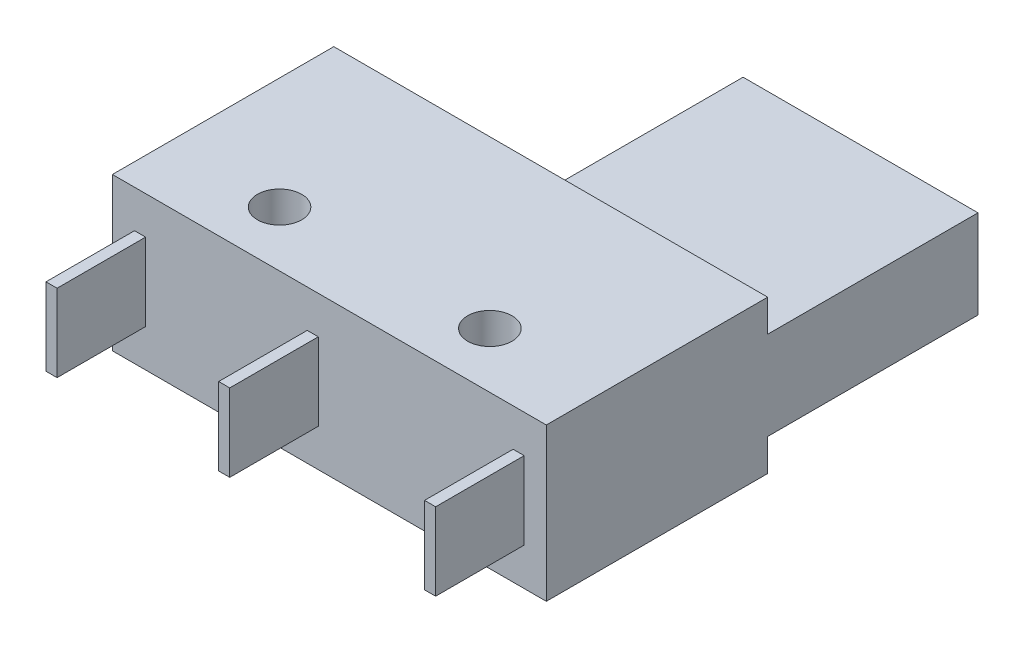
ISO-10303-21;
HEADER;
FILE_DESCRIPTION(('STEP AP214'),'2;1');
FILE_NAME('part.step','',(''),(''),'','','');
FILE_SCHEMA(('AUTOMOTIVE_DESIGN { 1 0 10303 214 1 1 1 1 }'));
ENDSEC;
DATA;
#1=APPLICATION_CONTEXT('core data for automotive mechanical design processes');
#2=APPLICATION_PROTOCOL_DEFINITION('international standard','automotive_design',2000,#1);
#3=PRODUCT_CONTEXT('',#1,'mechanical');
#4=PRODUCT('Part','Part','',(#3));
#5=PRODUCT_RELATED_PRODUCT_CATEGORY('part','',(#4));
#6=PRODUCT_DEFINITION_FORMATION('','',#4);
#7=PRODUCT_DEFINITION_CONTEXT('part definition',#1,'design');
#8=PRODUCT_DEFINITION('design','',#6,#7);
#9=PRODUCT_DEFINITION_SHAPE('','',#8);
#10=(LENGTH_UNIT() NAMED_UNIT(*) SI_UNIT(.MILLI.,.METRE.));
#11=(NAMED_UNIT(*) PLANE_ANGLE_UNIT() SI_UNIT($,.RADIAN.));
#12=(NAMED_UNIT(*) SI_UNIT($,.STERADIAN.) SOLID_ANGLE_UNIT());
#13=UNCERTAINTY_MEASURE_WITH_UNIT(LENGTH_MEASURE(1.E-05),#10,'distance_accuracy_value','');
#14=(GEOMETRIC_REPRESENTATION_CONTEXT(3) GLOBAL_UNCERTAINTY_ASSIGNED_CONTEXT((#13)) GLOBAL_UNIT_ASSIGNED_CONTEXT((#10,
#11,#12)) REPRESENTATION_CONTEXT('',''));
#15=CARTESIAN_POINT('',(0.,0.,0.));
#16=DIRECTION('',(0.,0.,1.));
#17=DIRECTION('',(1.,0.,0.));
#18=AXIS2_PLACEMENT_3D('',#15,#16,#17);
#19=CARTESIAN_POINT('',(0.,6.9,-10.));
#20=DIRECTION('',(0.,0.,1.));
#21=DIRECTION('',(1.,0.,0.));
#22=AXIS2_PLACEMENT_3D('',#19,#20,#21);
#23=PLANE('',#22);
#24=DIRECTION('',(1.,0.,0.));
#25=VECTOR('',#24,1.);
#26=CARTESIAN_POINT('',(19.6,5.45,-10.));
#27=LINE('',#26,#25);
#28=CARTESIAN_POINT('',(8.98876628778559,5.45,-10.));
#29=VERTEX_POINT('',#28);
#30=CARTESIAN_POINT('',(19.6,5.45,-10.));
#31=VERTEX_POINT('',#30);
#32=EDGE_CURVE('E52',#29,#31,#27,.T.);
#33=ORIENTED_EDGE('',*,*,#32,.F.);
#34=DIRECTION('',(0.,1.,0.));
#35=VECTOR('',#34,1.);
#36=CARTESIAN_POINT('',(8.98876628778559,5.45,-10.));
#37=LINE('',#36,#35);
#38=CARTESIAN_POINT('',(8.98876628778559,1.45,-10.));
#39=VERTEX_POINT('',#38);
#40=EDGE_CURVE('E211',#39,#29,#37,.T.);
#41=ORIENTED_EDGE('',*,*,#40,.F.);
#42=DIRECTION('',(-1.,0.,0.));
#43=VECTOR('',#42,1.);
#44=CARTESIAN_POINT('',(19.6,1.45,-10.));
#45=LINE('',#44,#43);
#46=CARTESIAN_POINT('',(19.6,1.45,-10.));
#47=VERTEX_POINT('',#46);
#48=EDGE_CURVE('E58',#47,#39,#45,.T.);
#49=ORIENTED_EDGE('',*,*,#48,.F.);
#50=DIRECTION('',(0.,-1.,0.));
#51=VECTOR('',#50,1.);
#52=CARTESIAN_POINT('',(19.6,6.9,-10.));
#53=LINE('',#52,#51);
#54=CARTESIAN_POINT('',(19.6,0.,-10.));
#55=VERTEX_POINT('',#54);
#56=EDGE_CURVE('E195',#47,#55,#53,.T.);
#57=ORIENTED_EDGE('',*,*,#56,.T.);
#58=DIRECTION('',(-1.,0.,0.));
#59=VECTOR('',#58,1.);
#60=CARTESIAN_POINT('',(0.,0.,-10.));
#61=LINE('',#60,#59);
#62=CARTESIAN_POINT('',(0.,0.,-10.));
#63=VERTEX_POINT('',#62);
#64=EDGE_CURVE('E320',#55,#63,#61,.T.);
#65=ORIENTED_EDGE('',*,*,#64,.T.);
#66=DIRECTION('',(0.,-1.,0.));
#67=VECTOR('',#66,1.);
#68=CARTESIAN_POINT('',(0.,6.9,-10.));
#69=LINE('',#68,#67);
#70=CARTESIAN_POINT('',(0.,6.9,-10.));
#71=VERTEX_POINT('',#70);
#72=EDGE_CURVE('E326',#71,#63,#69,.T.);
#73=ORIENTED_EDGE('',*,*,#72,.F.);
#74=DIRECTION('',(-1.,0.,0.));
#75=VECTOR('',#74,1.);
#76=CARTESIAN_POINT('',(0.,6.9,-10.));
#77=LINE('',#76,#75);
#78=CARTESIAN_POINT('',(19.6,6.9,-10.));
#79=VERTEX_POINT('',#78);
#80=EDGE_CURVE('E324',#79,#71,#77,.T.);
#81=ORIENTED_EDGE('',*,*,#80,.F.);
#82=EDGE_CURVE('E341',#79,#31,#53,.T.);
#83=ORIENTED_EDGE('',*,*,#82,.T.);
#84=EDGE_LOOP('',(#33,#41,#49,#57,#65,#73,#81,#83));
#85=FACE_BOUND('',#84,.T.);
#86=ADVANCED_FACE('F35',(#85),#23,.F.);
#87=CARTESIAN_POINT('',(0.,6.9,0.));
#88=DIRECTION('',(0.,0.,-1.));
#89=DIRECTION('',(-1.,0.,0.));
#90=AXIS2_PLACEMENT_3D('',#87,#88,#89);
#91=PLANE('',#90);
#92=DIRECTION('',(0.,-1.,0.));
#93=VECTOR('',#92,1.);
#94=CARTESIAN_POINT('',(8.8,5.2,0.));
#95=LINE('',#94,#93);
#96=CARTESIAN_POINT('',(8.8,5.2,0.));
#97=VERTEX_POINT('',#96);
#98=CARTESIAN_POINT('',(8.8,1.7,0.));
#99=VERTEX_POINT('',#98);
#100=EDGE_CURVE('E249',#97,#99,#95,.T.);
#101=ORIENTED_EDGE('',*,*,#100,.F.);
#102=DIRECTION('',(-1.,0.,0.));
#103=VECTOR('',#102,1.);
#104=CARTESIAN_POINT('',(8.8,5.2,0.));
#105=LINE('',#104,#103);
#106=CARTESIAN_POINT('',(9.3,5.2,0.));
#107=VERTEX_POINT('',#106);
#108=EDGE_CURVE('E254',#107,#97,#105,.T.);
#109=ORIENTED_EDGE('',*,*,#108,.F.);
#110=DIRECTION('',(0.,1.,0.));
#111=VECTOR('',#110,1.);
#112=CARTESIAN_POINT('',(9.3,5.2,0.));
#113=LINE('',#112,#111);
#114=CARTESIAN_POINT('',(9.3,1.7,0.));
#115=VERTEX_POINT('',#114);
#116=EDGE_CURVE('E266',#115,#107,#113,.T.);
#117=ORIENTED_EDGE('',*,*,#116,.F.);
#118=DIRECTION('',(1.,0.,0.));
#119=VECTOR('',#118,1.);
#120=CARTESIAN_POINT('',(8.8,1.7,0.));
#121=LINE('',#120,#119);
#122=EDGE_CURVE('E263',#99,#115,#121,.T.);
#123=ORIENTED_EDGE('',*,*,#122,.F.);
#124=EDGE_LOOP('',(#101,#109,#117,#123));
#125=FACE_BOUND('',#124,.T.);
#126=DIRECTION('',(1.,0.,0.));
#127=VECTOR('',#126,1.);
#128=CARTESIAN_POINT('',(0.,0.,0.));
#129=LINE('',#128,#127);
#130=CARTESIAN_POINT('',(0.,0.,0.));
#131=VERTEX_POINT('',#130);
#132=CARTESIAN_POINT('',(19.6,0.,0.));
#133=VERTEX_POINT('',#132);
#134=EDGE_CURVE('E329',#131,#133,#129,.T.);
#135=ORIENTED_EDGE('',*,*,#134,.T.);
#136=DIRECTION('',(0.,-1.,0.));
#137=VECTOR('',#136,1.);
#138=CARTESIAN_POINT('',(19.6,6.9,0.));
#139=LINE('',#138,#137);
#140=CARTESIAN_POINT('',(19.6,6.9,0.));
#141=VERTEX_POINT('',#140);
#142=EDGE_CURVE('E44',#141,#133,#139,.T.);
#143=ORIENTED_EDGE('',*,*,#142,.F.);
#144=DIRECTION('',(1.,0.,0.));
#145=VECTOR('',#144,1.);
#146=CARTESIAN_POINT('',(0.,6.9,0.));
#147=LINE('',#146,#145);
#148=CARTESIAN_POINT('',(0.,6.9,0.));
#149=VERTEX_POINT('',#148);
#150=EDGE_CURVE('E319',#149,#141,#147,.T.);
#151=ORIENTED_EDGE('',*,*,#150,.F.);
#152=DIRECTION('',(0.,-1.,0.));
#153=VECTOR('',#152,1.);
#154=CARTESIAN_POINT('',(0.,6.9,0.));
#155=LINE('',#154,#153);
#156=EDGE_CURVE('E11',#149,#131,#155,.T.);
#157=ORIENTED_EDGE('',*,*,#156,.T.);
#158=EDGE_LOOP('',(#135,#143,#151,#157));
#159=FACE_BOUND('',#158,.T.);
#160=DIRECTION('',(0.,-1.,0.));
#161=VECTOR('',#160,1.);
#162=CARTESIAN_POINT('',(1.,5.2,0.));
#163=LINE('',#162,#161);
#164=CARTESIAN_POINT('',(1.,5.2,0.));
#165=VERTEX_POINT('',#164);
#166=CARTESIAN_POINT('',(1.,1.7,0.));
#167=VERTEX_POINT('',#166);
#168=EDGE_CURVE('E282',#165,#167,#163,.T.);
#169=ORIENTED_EDGE('',*,*,#168,.F.);
#170=DIRECTION('',(-1.,0.,0.));
#171=VECTOR('',#170,1.);
#172=CARTESIAN_POINT('',(1.,5.2,0.));
#173=LINE('',#172,#171);
#174=CARTESIAN_POINT('',(1.5,5.2,0.));
#175=VERTEX_POINT('',#174);
#176=EDGE_CURVE('E287',#175,#165,#173,.T.);
#177=ORIENTED_EDGE('',*,*,#176,.F.);
#178=DIRECTION('',(0.,1.,0.));
#179=VECTOR('',#178,1.);
#180=CARTESIAN_POINT('',(1.5,5.2,0.));
#181=LINE('',#180,#179);
#182=CARTESIAN_POINT('',(1.5,1.7,0.));
#183=VERTEX_POINT('',#182);
#184=EDGE_CURVE('E299',#183,#175,#181,.T.);
#185=ORIENTED_EDGE('',*,*,#184,.F.);
#186=DIRECTION('',(1.,0.,0.));
#187=VECTOR('',#186,1.);
#188=CARTESIAN_POINT('',(1.,1.7,0.));
#189=LINE('',#188,#187);
#190=EDGE_CURVE('E296',#167,#183,#189,.T.);
#191=ORIENTED_EDGE('',*,*,#190,.F.);
#192=EDGE_LOOP('',(#169,#177,#185,#191));
#193=FACE_BOUND('',#192,.T.);
#194=DIRECTION('',(0.,-1.,0.));
#195=VECTOR('',#194,1.);
#196=CARTESIAN_POINT('',(18.1,5.2,0.));
#197=LINE('',#196,#195);
#198=CARTESIAN_POINT('',(18.1,5.2,0.));
#199=VERTEX_POINT('',#198);
#200=CARTESIAN_POINT('',(18.1,1.7,0.));
#201=VERTEX_POINT('',#200);
#202=EDGE_CURVE('E196',#199,#201,#197,.T.);
#203=ORIENTED_EDGE('',*,*,#202,.F.);
#204=DIRECTION('',(-1.,0.,0.));
#205=VECTOR('',#204,1.);
#206=CARTESIAN_POINT('',(18.1,5.2,0.));
#207=LINE('',#206,#205);
#208=CARTESIAN_POINT('',(18.6,5.2,0.));
#209=VERTEX_POINT('',#208);
#210=EDGE_CURVE('E224',#209,#199,#207,.T.);
#211=ORIENTED_EDGE('',*,*,#210,.F.);
#212=DIRECTION('',(0.,1.,0.));
#213=VECTOR('',#212,1.);
#214=CARTESIAN_POINT('',(18.6,5.2,0.));
#215=LINE('',#214,#213);
#216=CARTESIAN_POINT('',(18.6,1.7,0.));
#217=VERTEX_POINT('',#216);
#218=EDGE_CURVE('E233',#217,#209,#215,.T.);
#219=ORIENTED_EDGE('',*,*,#218,.F.);
#220=DIRECTION('',(1.,0.,0.));
#221=VECTOR('',#220,1.);
#222=CARTESIAN_POINT('',(18.1,1.7,0.));
#223=LINE('',#222,#221);
#224=EDGE_CURVE('E199',#201,#217,#223,.T.);
#225=ORIENTED_EDGE('',*,*,#224,.F.);
#226=EDGE_LOOP('',(#203,#211,#219,#225));
#227=FACE_BOUND('',#226,.T.);
#228=ADVANCED_FACE('F396',(#125,#159,#193,#227),#91,.F.);
#229=CARTESIAN_POINT('',(0.,6.9,0.));
#230=DIRECTION('',(1.,0.,0.));
#231=DIRECTION('',(0.,0.,-1.));
#232=AXIS2_PLACEMENT_3D('',#229,#230,#231);
#233=PLANE('',#232);
#234=DIRECTION('',(0.,0.,1.));
#235=VECTOR('',#234,1.);
#236=CARTESIAN_POINT('',(0.,0.,0.));
#237=LINE('',#236,#235);
#238=EDGE_CURVE('E315',#63,#131,#237,.T.);
#239=ORIENTED_EDGE('',*,*,#238,.T.);
#240=ORIENTED_EDGE('',*,*,#156,.F.);
#241=DIRECTION('',(0.,0.,1.));
#242=VECTOR('',#241,1.);
#243=CARTESIAN_POINT('',(0.,6.9,0.));
#244=LINE('',#243,#242);
#245=EDGE_CURVE('E316',#71,#149,#244,.T.);
#246=ORIENTED_EDGE('',*,*,#245,.F.);
#247=ORIENTED_EDGE('',*,*,#72,.T.);
#248=EDGE_LOOP('',(#239,#240,#246,#247));
#249=FACE_BOUND('',#248,.T.);
#250=ADVANCED_FACE('F37',(#249),#233,.F.);
#251=CARTESIAN_POINT('',(19.6,6.9,0.));
#252=DIRECTION('',(-1.,0.,0.));
#253=DIRECTION('',(0.,0.,1.));
#254=AXIS2_PLACEMENT_3D('',#251,#252,#253);
#255=PLANE('',#254);
#256=DIRECTION('',(0.,0.,-1.));
#257=VECTOR('',#256,1.);
#258=CARTESIAN_POINT('',(19.6,0.,0.));
#259=LINE('',#258,#257);
#260=EDGE_CURVE('E331',#133,#55,#259,.T.);
#261=ORIENTED_EDGE('',*,*,#260,.T.);
#262=ORIENTED_EDGE('',*,*,#56,.F.);
#263=DIRECTION('',(0.,0.,1.));
#264=VECTOR('',#263,1.);
#265=CARTESIAN_POINT('',(19.6,1.45,-19.5));
#266=LINE('',#265,#264);
#267=CARTESIAN_POINT('',(19.6,1.45,-19.5));
#268=VERTEX_POINT('',#267);
#269=EDGE_CURVE('E177',#268,#47,#266,.T.);
#270=ORIENTED_EDGE('',*,*,#269,.F.);
#271=DIRECTION('',(0.,-1.,0.));
#272=VECTOR('',#271,1.);
#273=CARTESIAN_POINT('',(19.6,5.45,-19.5));
#274=LINE('',#273,#272);
#275=CARTESIAN_POINT('',(19.6,5.45,-19.5));
#276=VERTEX_POINT('',#275);
#277=EDGE_CURVE('E183',#276,#268,#274,.T.);
#278=ORIENTED_EDGE('',*,*,#277,.F.);
#279=DIRECTION('',(0.,0.,1.));
#280=VECTOR('',#279,1.);
#281=CARTESIAN_POINT('',(19.6,5.45,-19.5));
#282=LINE('',#281,#280);
#283=EDGE_CURVE('E212',#276,#31,#282,.T.);
#284=ORIENTED_EDGE('',*,*,#283,.T.);
#285=ORIENTED_EDGE('',*,*,#82,.F.);
#286=DIRECTION('',(0.,0.,-1.));
#287=VECTOR('',#286,1.);
#288=CARTESIAN_POINT('',(19.6,6.9,0.));
#289=LINE('',#288,#287);
#290=EDGE_CURVE('E322',#141,#79,#289,.T.);
#291=ORIENTED_EDGE('',*,*,#290,.F.);
#292=ORIENTED_EDGE('',*,*,#142,.T.);
#293=EDGE_LOOP('',(#261,#262,#270,#278,#284,#285,#291,#292));
#294=FACE_BOUND('',#293,.T.);
#295=ADVANCED_FACE('F194',(#294),#255,.F.);
#296=CARTESIAN_POINT('',(0.,6.9,0.));
#297=DIRECTION('',(0.,-1.,0.));
#298=DIRECTION('',(0.,0.,-1.));
#299=AXIS2_PLACEMENT_3D('',#296,#297,#298);
#300=PLANE('',#299);
#301=CARTESIAN_POINT('',(14.55,6.9,-2.5));
#302=DIRECTION('',(0.,1.,0.));
#303=DIRECTION('',(0.,0.,1.));
#304=AXIS2_PLACEMENT_3D('',#301,#302,#303);
#305=CIRCLE('',#304,1.);
#306=CARTESIAN_POINT('',(14.55,6.9,-1.5));
#307=VERTEX_POINT('',#306);
#308=EDGE_CURVE('E365',#307,#307,#305,.T.);
#309=ORIENTED_EDGE('',*,*,#308,.F.);
#310=EDGE_LOOP('',(#309));
#311=FACE_BOUND('',#310,.T.);
#312=CARTESIAN_POINT('',(5.05,6.9,-2.5));
#313=DIRECTION('',(0.,1.,0.));
#314=DIRECTION('',(0.,0.,1.));
#315=AXIS2_PLACEMENT_3D('',#312,#313,#314);
#316=CIRCLE('',#315,1.);
#317=CARTESIAN_POINT('',(5.05,6.9,-1.5));
#318=VERTEX_POINT('',#317);
#319=EDGE_CURVE('E361',#318,#318,#316,.T.);
#320=ORIENTED_EDGE('',*,*,#319,.F.);
#321=EDGE_LOOP('',(#320));
#322=FACE_BOUND('',#321,.T.);
#323=ORIENTED_EDGE('',*,*,#245,.T.);
#324=ORIENTED_EDGE('',*,*,#150,.T.);
#325=ORIENTED_EDGE('',*,*,#290,.T.);
#326=ORIENTED_EDGE('',*,*,#80,.T.);
#327=EDGE_LOOP('',(#323,#324,#325,#326));
#328=FACE_BOUND('',#327,.T.);
#329=ADVANCED_FACE('F357',(#311,#322,#328),#300,.F.);
#330=CARTESIAN_POINT('',(0.,0.,0.));
#331=DIRECTION('',(0.,-1.,0.));
#332=DIRECTION('',(0.,0.,-1.));
#333=AXIS2_PLACEMENT_3D('',#330,#331,#332);
#334=PLANE('',#333);
#335=CARTESIAN_POINT('',(14.55,0.,-2.5));
#336=DIRECTION('',(0.,-1.,0.));
#337=DIRECTION('',(0.,0.,-1.));
#338=AXIS2_PLACEMENT_3D('',#335,#336,#337);
#339=CIRCLE('',#338,1.);
#340=CARTESIAN_POINT('',(14.55,0.,-3.5));
#341=VERTEX_POINT('',#340);
#342=EDGE_CURVE('E39',#341,#341,#339,.T.);
#343=ORIENTED_EDGE('',*,*,#342,.F.);
#344=EDGE_LOOP('',(#343));
#345=FACE_BOUND('',#344,.T.);
#346=CARTESIAN_POINT('',(5.05,0.,-2.5));
#347=DIRECTION('',(0.,-1.,0.));
#348=DIRECTION('',(0.,0.,-1.));
#349=AXIS2_PLACEMENT_3D('',#346,#347,#348);
#350=CIRCLE('',#349,1.);
#351=CARTESIAN_POINT('',(5.05,0.,-3.5));
#352=VERTEX_POINT('',#351);
#353=EDGE_CURVE('E364',#352,#352,#350,.T.);
#354=ORIENTED_EDGE('',*,*,#353,.F.);
#355=EDGE_LOOP('',(#354));
#356=FACE_BOUND('',#355,.T.);
#357=ORIENTED_EDGE('',*,*,#238,.F.);
#358=ORIENTED_EDGE('',*,*,#64,.F.);
#359=ORIENTED_EDGE('',*,*,#260,.F.);
#360=ORIENTED_EDGE('',*,*,#134,.F.);
#361=EDGE_LOOP('',(#357,#358,#359,#360));
#362=FACE_BOUND('',#361,.T.);
#363=ADVANCED_FACE('F352',(#345,#356,#362),#334,.T.);
#364=CARTESIAN_POINT('',(1.,5.2,4.));
#365=DIRECTION('',(1.,0.,0.));
#366=DIRECTION('',(0.,0.,-1.));
#367=AXIS2_PLACEMENT_3D('',#364,#365,#366);
#368=PLANE('',#367);
#369=ORIENTED_EDGE('',*,*,#168,.T.);
#370=DIRECTION('',(0.,0.,-1.));
#371=VECTOR('',#370,1.);
#372=CARTESIAN_POINT('',(1.,1.7,4.));
#373=LINE('',#372,#371);
#374=CARTESIAN_POINT('',(1.,1.7,4.));
#375=VERTEX_POINT('',#374);
#376=EDGE_CURVE('E312',#375,#167,#373,.T.);
#377=ORIENTED_EDGE('',*,*,#376,.F.);
#378=DIRECTION('',(0.,-1.,0.));
#379=VECTOR('',#378,1.);
#380=CARTESIAN_POINT('',(1.,5.2,4.));
#381=LINE('',#380,#379);
#382=CARTESIAN_POINT('',(1.,5.2,4.));
#383=VERTEX_POINT('',#382);
#384=EDGE_CURVE('E283',#383,#375,#381,.T.);
#385=ORIENTED_EDGE('',*,*,#384,.F.);
#386=DIRECTION('',(0.,0.,-1.));
#387=VECTOR('',#386,1.);
#388=CARTESIAN_POINT('',(1.,5.2,4.));
#389=LINE('',#388,#387);
#390=EDGE_CURVE('E293',#383,#165,#389,.T.);
#391=ORIENTED_EDGE('',*,*,#390,.T.);
#392=EDGE_LOOP('',(#369,#377,#385,#391));
#393=FACE_BOUND('',#392,.T.);
#394=ADVANCED_FACE('F376',(#393),#368,.F.);
#395=CARTESIAN_POINT('',(1.,1.7,4.));
#396=DIRECTION('',(0.,1.,0.));
#397=DIRECTION('',(-1.,0.,0.));
#398=AXIS2_PLACEMENT_3D('',#395,#396,#397);
#399=PLANE('',#398);
#400=ORIENTED_EDGE('',*,*,#190,.T.);
#401=DIRECTION('',(0.,0.,-1.));
#402=VECTOR('',#401,1.);
#403=CARTESIAN_POINT('',(1.5,1.7,4.));
#404=LINE('',#403,#402);
#405=CARTESIAN_POINT('',(1.5,1.7,4.));
#406=VERTEX_POINT('',#405);
#407=EDGE_CURVE('E309',#406,#183,#404,.T.);
#408=ORIENTED_EDGE('',*,*,#407,.F.);
#409=DIRECTION('',(1.,0.,0.));
#410=VECTOR('',#409,1.);
#411=CARTESIAN_POINT('',(1.,1.7,4.));
#412=LINE('',#411,#410);
#413=EDGE_CURVE('E286',#375,#406,#412,.T.);
#414=ORIENTED_EDGE('',*,*,#413,.F.);
#415=ORIENTED_EDGE('',*,*,#376,.T.);
#416=EDGE_LOOP('',(#400,#408,#414,#415));
#417=FACE_BOUND('',#416,.T.);
#418=ADVANCED_FACE('F426',(#417),#399,.F.);
#419=CARTESIAN_POINT('',(1.5,5.2,4.));
#420=DIRECTION('',(-1.,0.,0.));
#421=DIRECTION('',(0.,0.,1.));
#422=AXIS2_PLACEMENT_3D('',#419,#420,#421);
#423=PLANE('',#422);
#424=ORIENTED_EDGE('',*,*,#184,.T.);
#425=DIRECTION('',(0.,0.,-1.));
#426=VECTOR('',#425,1.);
#427=CARTESIAN_POINT('',(1.5,5.2,4.));
#428=LINE('',#427,#426);
#429=CARTESIAN_POINT('',(1.5,5.2,4.));
#430=VERTEX_POINT('',#429);
#431=EDGE_CURVE('E306',#430,#175,#428,.T.);
#432=ORIENTED_EDGE('',*,*,#431,.F.);
#433=DIRECTION('',(0.,1.,0.));
#434=VECTOR('',#433,1.);
#435=CARTESIAN_POINT('',(1.5,5.2,4.));
#436=LINE('',#435,#434);
#437=EDGE_CURVE('E289',#406,#430,#436,.T.);
#438=ORIENTED_EDGE('',*,*,#437,.F.);
#439=ORIENTED_EDGE('',*,*,#407,.T.);
#440=EDGE_LOOP('',(#424,#432,#438,#439));
#441=FACE_BOUND('',#440,.T.);
#442=ADVANCED_FACE('F436',(#441),#423,.F.);
#443=CARTESIAN_POINT('',(1.,5.2,4.));
#444=DIRECTION('',(0.,-1.,0.));
#445=DIRECTION('',(0.,0.,-1.));
#446=AXIS2_PLACEMENT_3D('',#443,#444,#445);
#447=PLANE('',#446);
#448=ORIENTED_EDGE('',*,*,#176,.T.);
#449=ORIENTED_EDGE('',*,*,#390,.F.);
#450=DIRECTION('',(-1.,0.,0.));
#451=VECTOR('',#450,1.);
#452=CARTESIAN_POINT('',(1.,5.2,4.));
#453=LINE('',#452,#451);
#454=EDGE_CURVE('E291',#430,#383,#453,.T.);
#455=ORIENTED_EDGE('',*,*,#454,.F.);
#456=ORIENTED_EDGE('',*,*,#431,.T.);
#457=EDGE_LOOP('',(#448,#449,#455,#456));
#458=FACE_BOUND('',#457,.T.);
#459=ADVANCED_FACE('F446',(#458),#447,.F.);
#460=CARTESIAN_POINT('',(0.,0.,4.));
#461=DIRECTION('',(0.,0.,1.));
#462=DIRECTION('',(1.,0.,0.));
#463=AXIS2_PLACEMENT_3D('',#460,#461,#462);
#464=PLANE('',#463);
#465=ORIENTED_EDGE('',*,*,#384,.T.);
#466=ORIENTED_EDGE('',*,*,#413,.T.);
#467=ORIENTED_EDGE('',*,*,#437,.T.);
#468=ORIENTED_EDGE('',*,*,#454,.T.);
#469=EDGE_LOOP('',(#465,#466,#467,#468));
#470=FACE_BOUND('',#469,.T.);
#471=ADVANCED_FACE('F456',(#470),#464,.T.);
#472=CARTESIAN_POINT('',(8.8,5.2,4.));
#473=DIRECTION('',(1.,0.,0.));
#474=DIRECTION('',(0.,0.,-1.));
#475=AXIS2_PLACEMENT_3D('',#472,#473,#474);
#476=PLANE('',#475);
#477=ORIENTED_EDGE('',*,*,#100,.T.);
#478=DIRECTION('',(0.,0.,-1.));
#479=VECTOR('',#478,1.);
#480=CARTESIAN_POINT('',(8.8,1.7,4.));
#481=LINE('',#480,#479);
#482=CARTESIAN_POINT('',(8.8,1.7,4.));
#483=VERTEX_POINT('',#482);
#484=EDGE_CURVE('E279',#483,#99,#481,.T.);
#485=ORIENTED_EDGE('',*,*,#484,.F.);
#486=DIRECTION('',(0.,-1.,0.));
#487=VECTOR('',#486,1.);
#488=CARTESIAN_POINT('',(8.8,5.2,4.));
#489=LINE('',#488,#487);
#490=CARTESIAN_POINT('',(8.8,5.2,4.));
#491=VERTEX_POINT('',#490);
#492=EDGE_CURVE('E250',#491,#483,#489,.T.);
#493=ORIENTED_EDGE('',*,*,#492,.F.);
#494=DIRECTION('',(0.,0.,-1.));
#495=VECTOR('',#494,1.);
#496=CARTESIAN_POINT('',(8.8,5.2,4.));
#497=LINE('',#496,#495);
#498=EDGE_CURVE('E260',#491,#97,#497,.T.);
#499=ORIENTED_EDGE('',*,*,#498,.T.);
#500=EDGE_LOOP('',(#477,#485,#493,#499));
#501=FACE_BOUND('',#500,.T.);
#502=ADVANCED_FACE('F466',(#501),#476,.F.);
#503=CARTESIAN_POINT('',(8.8,1.7,4.));
#504=DIRECTION('',(0.,1.,0.));
#505=DIRECTION('',(0.,0.,1.));
#506=AXIS2_PLACEMENT_3D('',#503,#504,#505);
#507=PLANE('',#506);
#508=ORIENTED_EDGE('',*,*,#122,.T.);
#509=DIRECTION('',(0.,0.,-1.));
#510=VECTOR('',#509,1.);
#511=CARTESIAN_POINT('',(9.3,1.7,4.));
#512=LINE('',#511,#510);
#513=CARTESIAN_POINT('',(9.3,1.7,4.));
#514=VERTEX_POINT('',#513);
#515=EDGE_CURVE('E276',#514,#115,#512,.T.);
#516=ORIENTED_EDGE('',*,*,#515,.F.);
#517=DIRECTION('',(1.,0.,0.));
#518=VECTOR('',#517,1.);
#519=CARTESIAN_POINT('',(8.8,1.7,4.));
#520=LINE('',#519,#518);
#521=EDGE_CURVE('E253',#483,#514,#520,.T.);
#522=ORIENTED_EDGE('',*,*,#521,.F.);
#523=ORIENTED_EDGE('',*,*,#484,.T.);
#524=EDGE_LOOP('',(#508,#516,#522,#523));
#525=FACE_BOUND('',#524,.T.);
#526=ADVANCED_FACE('F476',(#525),#507,.F.);
#527=CARTESIAN_POINT('',(9.3,5.2,4.));
#528=DIRECTION('',(-1.,0.,0.));
#529=DIRECTION('',(0.,0.,1.));
#530=AXIS2_PLACEMENT_3D('',#527,#528,#529);
#531=PLANE('',#530);
#532=ORIENTED_EDGE('',*,*,#116,.T.);
#533=DIRECTION('',(0.,0.,-1.));
#534=VECTOR('',#533,1.);
#535=CARTESIAN_POINT('',(9.3,5.2,4.));
#536=LINE('',#535,#534);
#537=CARTESIAN_POINT('',(9.3,5.2,4.));
#538=VERTEX_POINT('',#537);
#539=EDGE_CURVE('E273',#538,#107,#536,.T.);
#540=ORIENTED_EDGE('',*,*,#539,.F.);
#541=DIRECTION('',(0.,1.,0.));
#542=VECTOR('',#541,1.);
#543=CARTESIAN_POINT('',(9.3,5.2,4.));
#544=LINE('',#543,#542);
#545=EDGE_CURVE('E256',#514,#538,#544,.T.);
#546=ORIENTED_EDGE('',*,*,#545,.F.);
#547=ORIENTED_EDGE('',*,*,#515,.T.);
#548=EDGE_LOOP('',(#532,#540,#546,#547));
#549=FACE_BOUND('',#548,.T.);
#550=ADVANCED_FACE('F486',(#549),#531,.F.);
#551=CARTESIAN_POINT('',(8.8,5.2,4.));
#552=DIRECTION('',(0.,-1.,0.));
#553=DIRECTION('',(0.,0.,-1.));
#554=AXIS2_PLACEMENT_3D('',#551,#552,#553);
#555=PLANE('',#554);
#556=ORIENTED_EDGE('',*,*,#108,.T.);
#557=ORIENTED_EDGE('',*,*,#498,.F.);
#558=DIRECTION('',(-1.,0.,0.));
#559=VECTOR('',#558,1.);
#560=CARTESIAN_POINT('',(8.8,5.2,4.));
#561=LINE('',#560,#559);
#562=EDGE_CURVE('E258',#538,#491,#561,.T.);
#563=ORIENTED_EDGE('',*,*,#562,.F.);
#564=ORIENTED_EDGE('',*,*,#539,.T.);
#565=EDGE_LOOP('',(#556,#557,#563,#564));
#566=FACE_BOUND('',#565,.T.);
#567=ADVANCED_FACE('F496',(#566),#555,.F.);
#568=CARTESIAN_POINT('',(0.,0.,4.));
#569=DIRECTION('',(0.,0.,1.));
#570=DIRECTION('',(1.,0.,0.));
#571=AXIS2_PLACEMENT_3D('',#568,#569,#570);
#572=PLANE('',#571);
#573=ORIENTED_EDGE('',*,*,#492,.T.);
#574=ORIENTED_EDGE('',*,*,#521,.T.);
#575=ORIENTED_EDGE('',*,*,#545,.T.);
#576=ORIENTED_EDGE('',*,*,#562,.T.);
#577=EDGE_LOOP('',(#573,#574,#575,#576));
#578=FACE_BOUND('',#577,.T.);
#579=ADVANCED_FACE('F506',(#578),#572,.T.);
#580=CARTESIAN_POINT('',(18.1,5.2,4.));
#581=DIRECTION('',(1.,0.,0.));
#582=DIRECTION('',(0.,0.,-1.));
#583=AXIS2_PLACEMENT_3D('',#580,#581,#582);
#584=PLANE('',#583);
#585=ORIENTED_EDGE('',*,*,#202,.T.);
#586=DIRECTION('',(0.,0.,-1.));
#587=VECTOR('',#586,1.);
#588=CARTESIAN_POINT('',(18.1,1.7,4.));
#589=LINE('',#588,#587);
#590=CARTESIAN_POINT('',(18.1,1.7,4.));
#591=VERTEX_POINT('',#590);
#592=EDGE_CURVE('E246',#591,#201,#589,.T.);
#593=ORIENTED_EDGE('',*,*,#592,.F.);
#594=DIRECTION('',(0.,-1.,0.));
#595=VECTOR('',#594,1.);
#596=CARTESIAN_POINT('',(18.1,5.2,4.));
#597=LINE('',#596,#595);
#598=CARTESIAN_POINT('',(18.1,5.2,4.));
#599=VERTEX_POINT('',#598);
#600=EDGE_CURVE('E220',#599,#591,#597,.T.);
#601=ORIENTED_EDGE('',*,*,#600,.F.);
#602=DIRECTION('',(0.,0.,-1.));
#603=VECTOR('',#602,1.);
#604=CARTESIAN_POINT('',(18.1,5.2,4.));
#605=LINE('',#604,#603);
#606=EDGE_CURVE('E229',#599,#199,#605,.T.);
#607=ORIENTED_EDGE('',*,*,#606,.T.);
#608=EDGE_LOOP('',(#585,#593,#601,#607));
#609=FACE_BOUND('',#608,.T.);
#610=ADVANCED_FACE('F516',(#609),#584,.F.);
#611=CARTESIAN_POINT('',(18.1,1.7,4.));
#612=DIRECTION('',(0.,1.,0.));
#613=DIRECTION('',(-1.,0.,0.));
#614=AXIS2_PLACEMENT_3D('',#611,#612,#613);
#615=PLANE('',#614);
#616=ORIENTED_EDGE('',*,*,#224,.T.);
#617=DIRECTION('',(0.,0.,-1.));
#618=VECTOR('',#617,1.);
#619=CARTESIAN_POINT('',(18.6,1.7,4.));
#620=LINE('',#619,#618);
#621=CARTESIAN_POINT('',(18.6,1.7,4.));
#622=VERTEX_POINT('',#621);
#623=EDGE_CURVE('E243',#622,#217,#620,.T.);
#624=ORIENTED_EDGE('',*,*,#623,.F.);
#625=DIRECTION('',(1.,0.,0.));
#626=VECTOR('',#625,1.);
#627=CARTESIAN_POINT('',(18.1,1.7,4.));
#628=LINE('',#627,#626);
#629=EDGE_CURVE('E223',#591,#622,#628,.T.);
#630=ORIENTED_EDGE('',*,*,#629,.F.);
#631=ORIENTED_EDGE('',*,*,#592,.T.);
#632=EDGE_LOOP('',(#616,#624,#630,#631));
#633=FACE_BOUND('',#632,.T.);
#634=ADVANCED_FACE('F526',(#633),#615,.F.);
#635=CARTESIAN_POINT('',(18.6,5.2,4.));
#636=DIRECTION('',(-1.,0.,0.));
#637=DIRECTION('',(0.,-1.,0.));
#638=AXIS2_PLACEMENT_3D('',#635,#636,#637);
#639=PLANE('',#638);
#640=ORIENTED_EDGE('',*,*,#218,.T.);
#641=DIRECTION('',(0.,0.,-1.));
#642=VECTOR('',#641,1.);
#643=CARTESIAN_POINT('',(18.6,5.2,4.));
#644=LINE('',#643,#642);
#645=CARTESIAN_POINT('',(18.6,5.2,4.));
#646=VERTEX_POINT('',#645);
#647=EDGE_CURVE('E240',#646,#209,#644,.T.);
#648=ORIENTED_EDGE('',*,*,#647,.F.);
#649=DIRECTION('',(0.,1.,0.));
#650=VECTOR('',#649,1.);
#651=CARTESIAN_POINT('',(18.6,5.2,4.));
#652=LINE('',#651,#650);
#653=EDGE_CURVE('E226',#622,#646,#652,.T.);
#654=ORIENTED_EDGE('',*,*,#653,.F.);
#655=ORIENTED_EDGE('',*,*,#623,.T.);
#656=EDGE_LOOP('',(#640,#648,#654,#655));
#657=FACE_BOUND('',#656,.T.);
#658=ADVANCED_FACE('F536',(#657),#639,.F.);
#659=CARTESIAN_POINT('',(18.1,5.2,4.));
#660=DIRECTION('',(0.,-1.,0.));
#661=DIRECTION('',(0.,0.,-1.));
#662=AXIS2_PLACEMENT_3D('',#659,#660,#661);
#663=PLANE('',#662);
#664=ORIENTED_EDGE('',*,*,#210,.T.);
#665=ORIENTED_EDGE('',*,*,#606,.F.);
#666=DIRECTION('',(-1.,0.,0.));
#667=VECTOR('',#666,1.);
#668=CARTESIAN_POINT('',(18.1,5.2,4.));
#669=LINE('',#668,#667);
#670=EDGE_CURVE('E228',#646,#599,#669,.T.);
#671=ORIENTED_EDGE('',*,*,#670,.F.);
#672=ORIENTED_EDGE('',*,*,#647,.T.);
#673=EDGE_LOOP('',(#664,#665,#671,#672));
#674=FACE_BOUND('',#673,.T.);
#675=ADVANCED_FACE('F546',(#674),#663,.F.);
#676=CARTESIAN_POINT('',(0.,0.,4.));
#677=DIRECTION('',(0.,0.,1.));
#678=DIRECTION('',(1.,0.,0.));
#679=AXIS2_PLACEMENT_3D('',#676,#677,#678);
#680=PLANE('',#679);
#681=ORIENTED_EDGE('',*,*,#600,.T.);
#682=ORIENTED_EDGE('',*,*,#629,.T.);
#683=ORIENTED_EDGE('',*,*,#653,.T.);
#684=ORIENTED_EDGE('',*,*,#670,.T.);
#685=EDGE_LOOP('',(#681,#682,#683,#684));
#686=FACE_BOUND('',#685,.T.);
#687=ADVANCED_FACE('F556',(#686),#680,.T.);
#688=CARTESIAN_POINT('',(19.6,1.45,-19.5));
#689=DIRECTION('',(0.,1.,0.));
#690=DIRECTION('',(0.,0.,1.));
#691=AXIS2_PLACEMENT_3D('',#688,#689,#690);
#692=PLANE('',#691);
#693=ORIENTED_EDGE('',*,*,#48,.T.);
#694=DIRECTION('',(0.,0.,1.));
#695=VECTOR('',#694,1.);
#696=CARTESIAN_POINT('',(8.98876628778559,1.45,-19.5));
#697=LINE('',#696,#695);
#698=CARTESIAN_POINT('',(8.98876628778559,1.45,-19.5));
#699=VERTEX_POINT('',#698);
#700=EDGE_CURVE('E179',#699,#39,#697,.T.);
#701=ORIENTED_EDGE('',*,*,#700,.F.);
#702=DIRECTION('',(-1.,0.,0.));
#703=VECTOR('',#702,1.);
#704=CARTESIAN_POINT('',(19.6,1.45,-19.5));
#705=LINE('',#704,#703);
#706=EDGE_CURVE('E173',#268,#699,#705,.T.);
#707=ORIENTED_EDGE('',*,*,#706,.F.);
#708=ORIENTED_EDGE('',*,*,#269,.T.);
#709=EDGE_LOOP('',(#693,#701,#707,#708));
#710=FACE_BOUND('',#709,.T.);
#711=ADVANCED_FACE('F175',(#710),#692,.F.);
#712=CARTESIAN_POINT('',(8.98876628778559,5.45,-19.5));
#713=DIRECTION('',(1.,0.,0.));
#714=DIRECTION('',(0.,0.,-1.));
#715=AXIS2_PLACEMENT_3D('',#712,#713,#714);
#716=PLANE('',#715);
#717=ORIENTED_EDGE('',*,*,#40,.T.);
#718=DIRECTION('',(0.,0.,1.));
#719=VECTOR('',#718,1.);
#720=CARTESIAN_POINT('',(8.98876628778559,5.45,-19.5));
#721=LINE('',#720,#719);
#722=CARTESIAN_POINT('',(8.98876628778559,5.45,-19.5));
#723=VERTEX_POINT('',#722);
#724=EDGE_CURVE('E201',#723,#29,#721,.T.);
#725=ORIENTED_EDGE('',*,*,#724,.F.);
#726=DIRECTION('',(0.,1.,0.));
#727=VECTOR('',#726,1.);
#728=CARTESIAN_POINT('',(8.98876628778559,5.45,-19.5));
#729=LINE('',#728,#727);
#730=EDGE_CURVE('E182',#699,#723,#729,.T.);
#731=ORIENTED_EDGE('',*,*,#730,.F.);
#732=ORIENTED_EDGE('',*,*,#700,.T.);
#733=EDGE_LOOP('',(#717,#725,#731,#732));
#734=FACE_BOUND('',#733,.T.);
#735=ADVANCED_FACE('F384',(#734),#716,.F.);
#736=CARTESIAN_POINT('',(19.6,5.45,-19.5));
#737=DIRECTION('',(0.,-1.,0.));
#738=DIRECTION('',(0.,0.,-1.));
#739=AXIS2_PLACEMENT_3D('',#736,#737,#738);
#740=PLANE('',#739);
#741=ORIENTED_EDGE('',*,*,#32,.T.);
#742=ORIENTED_EDGE('',*,*,#283,.F.);
#743=DIRECTION('',(1.,0.,0.));
#744=VECTOR('',#743,1.);
#745=CARTESIAN_POINT('',(19.6,5.45,-19.5));
#746=LINE('',#745,#744);
#747=EDGE_CURVE('E188',#723,#276,#746,.T.);
#748=ORIENTED_EDGE('',*,*,#747,.F.);
#749=ORIENTED_EDGE('',*,*,#724,.T.);
#750=EDGE_LOOP('',(#741,#742,#748,#749));
#751=FACE_BOUND('',#750,.T.);
#752=ADVANCED_FACE('F385',(#751),#740,.F.);
#753=CARTESIAN_POINT('',(0.,0.,-19.5));
#754=DIRECTION('',(0.,0.,-1.));
#755=DIRECTION('',(-1.,0.,0.));
#756=AXIS2_PLACEMENT_3D('',#753,#754,#755);
#757=PLANE('',#756);
#758=ORIENTED_EDGE('',*,*,#277,.T.);
#759=ORIENTED_EDGE('',*,*,#706,.T.);
#760=ORIENTED_EDGE('',*,*,#730,.T.);
#761=ORIENTED_EDGE('',*,*,#747,.T.);
#762=EDGE_LOOP('',(#758,#759,#760,#761));
#763=FACE_BOUND('',#762,.T.);
#764=ADVANCED_FACE('F186',(#763),#757,.T.);
#765=CARTESIAN_POINT('',(5.05,-2.49999999998515E-05,-2.5));
#766=DIRECTION('',(0.,1.,0.));
#767=DIRECTION('',(0.,0.,1.));
#768=AXIS2_PLACEMENT_3D('',#765,#766,#767);
#769=CYLINDRICAL_SURFACE('',#768,1.);
#770=ORIENTED_EDGE('',*,*,#353,.T.);
#771=EDGE_LOOP('',(#770));
#772=FACE_BOUND('',#771,.T.);
#773=ORIENTED_EDGE('',*,*,#319,.T.);
#774=EDGE_LOOP('',(#773));
#775=FACE_BOUND('',#774,.T.);
#776=ADVANCED_FACE('F392',(#772,#775),#769,.F.);
#777=CARTESIAN_POINT('',(14.55,-2.49999999998515E-05,-2.5));
#778=DIRECTION('',(0.,1.,0.));
#779=DIRECTION('',(0.,0.,1.));
#780=AXIS2_PLACEMENT_3D('',#777,#778,#779);
#781=CYLINDRICAL_SURFACE('',#780,1.);
#782=ORIENTED_EDGE('',*,*,#342,.T.);
#783=EDGE_LOOP('',(#782));
#784=FACE_BOUND('',#783,.T.);
#785=ORIENTED_EDGE('',*,*,#308,.T.);
#786=EDGE_LOOP('',(#785));
#787=FACE_BOUND('',#786,.T.);
#788=ADVANCED_FACE('F372',(#784,#787),#781,.F.);
#789=CLOSED_SHELL('',(#86,#228,#250,#295,#329,#363,#394,#418,#442,#459,#471,#502,#526,#550,#567,
#579,#610,#634,#658,#675,#687,#711,#735,#752,#764,#776,#788));
#790=MANIFOLD_SOLID_BREP('B2',#789);
#791=ADVANCED_BREP_SHAPE_REPRESENTATION('',(#18,#790),#14);
#792=SHAPE_DEFINITION_REPRESENTATION(#9,#791);
ENDSEC;
END-ISO-10303-21;
